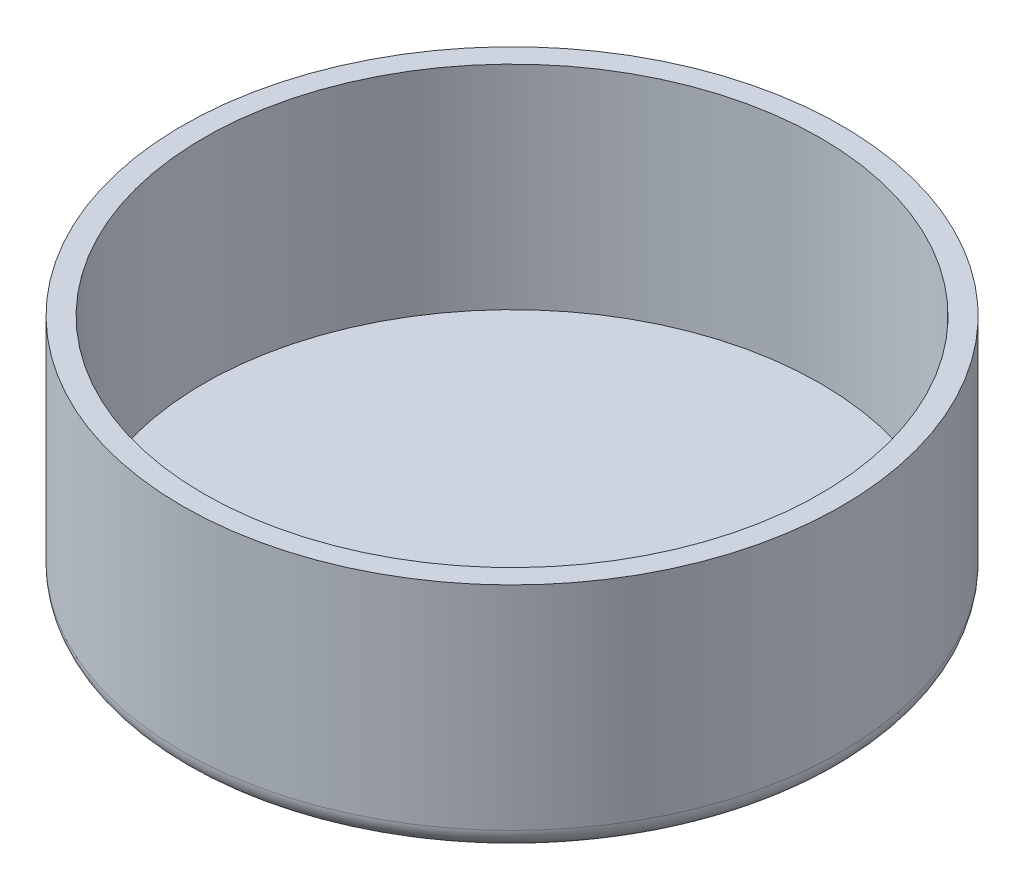
ISO-10303-21;
HEADER;
FILE_DESCRIPTION(('STEP AP214'),'2;1');
FILE_NAME('part.step','',(''),(''),'','','');
FILE_SCHEMA(('AUTOMOTIVE_DESIGN { 1 0 10303 214 1 1 1 1 }'));
ENDSEC;
DATA;
#1=APPLICATION_CONTEXT('core data for automotive mechanical design processes');
#2=APPLICATION_PROTOCOL_DEFINITION('international standard','automotive_design',2000,#1);
#3=PRODUCT_CONTEXT('',#1,'mechanical');
#4=PRODUCT('Part','Part','',(#3));
#5=PRODUCT_RELATED_PRODUCT_CATEGORY('part','',(#4));
#6=PRODUCT_DEFINITION_FORMATION('','',#4);
#7=PRODUCT_DEFINITION_CONTEXT('part definition',#1,'design');
#8=PRODUCT_DEFINITION('design','',#6,#7);
#9=PRODUCT_DEFINITION_SHAPE('','',#8);
#10=(LENGTH_UNIT() NAMED_UNIT(*) SI_UNIT(.MILLI.,.METRE.));
#11=(NAMED_UNIT(*) PLANE_ANGLE_UNIT() SI_UNIT($,.RADIAN.));
#12=(NAMED_UNIT(*) SI_UNIT($,.STERADIAN.) SOLID_ANGLE_UNIT());
#13=UNCERTAINTY_MEASURE_WITH_UNIT(LENGTH_MEASURE(1.E-05),#10,'distance_accuracy_value','');
#14=(GEOMETRIC_REPRESENTATION_CONTEXT(3) GLOBAL_UNCERTAINTY_ASSIGNED_CONTEXT((#13)) GLOBAL_UNIT_ASSIGNED_CONTEXT((#10,
#11,#12)) REPRESENTATION_CONTEXT('',''));
#15=CARTESIAN_POINT('',(0.,0.,0.));
#16=DIRECTION('',(0.,0.,1.));
#17=DIRECTION('',(1.,0.,0.));
#18=AXIS2_PLACEMENT_3D('',#15,#16,#17);
#19=CARTESIAN_POINT('',(0.,1.,0.));
#20=DIRECTION('',(0.,-1.,0.));
#21=DIRECTION('',(0.,0.,-1.));
#22=AXIS2_PLACEMENT_3D('',#19,#20,#21);
#23=CYLINDRICAL_SURFACE('',#22,15.5);
#24=CARTESIAN_POINT('',(0.,1.,0.));
#25=DIRECTION('',(0.,1.,0.));
#26=DIRECTION('',(0.,0.,1.));
#27=AXIS2_PLACEMENT_3D('',#24,#25,#26);
#28=CIRCLE('',#27,15.5);
#29=CARTESIAN_POINT('',(0.,1.,15.5));
#30=VERTEX_POINT('',#29);
#31=EDGE_CURVE('E38',#30,#30,#28,.T.);
#32=ORIENTED_EDGE('',*,*,#31,.T.);
#33=EDGE_LOOP('',(#32));
#34=FACE_BOUND('',#33,.T.);
#35=CARTESIAN_POINT('',(0.,11.,0.));
#36=DIRECTION('',(0.,1.,0.));
#37=DIRECTION('',(0.,0.,1.));
#38=AXIS2_PLACEMENT_3D('',#35,#36,#37);
#39=CIRCLE('',#38,15.5);
#40=CARTESIAN_POINT('',(0.,11.,15.5));
#41=VERTEX_POINT('',#40);
#42=EDGE_CURVE('E46',#41,#41,#39,.T.);
#43=ORIENTED_EDGE('',*,*,#42,.F.);
#44=EDGE_LOOP('',(#43));
#45=FACE_BOUND('',#44,.T.);
#46=ADVANCED_FACE('F31',(#34,#45),#23,.T.);
#47=CARTESIAN_POINT('',(0.,0.,0.));
#48=DIRECTION('',(0.,1.,0.));
#49=DIRECTION('',(0.,0.,1.));
#50=AXIS2_PLACEMENT_3D('',#47,#48,#49);
#51=PLANE('',#50);
#52=CARTESIAN_POINT('',(0.,0.,0.));
#53=DIRECTION('',(0.,1.,0.));
#54=DIRECTION('',(0.,0.,1.));
#55=AXIS2_PLACEMENT_3D('',#52,#53,#54);
#56=CIRCLE('',#55,14.5);
#57=CARTESIAN_POINT('',(0.,0.,14.5));
#58=VERTEX_POINT('',#57);
#59=EDGE_CURVE('E10',#58,#58,#56,.F.);
#60=ORIENTED_EDGE('',*,*,#59,.T.);
#61=EDGE_LOOP('',(#60));
#62=FACE_BOUND('',#61,.T.);
#63=ADVANCED_FACE('F60',(#62),#51,.F.);
#64=CARTESIAN_POINT('',(0.,11.,0.));
#65=DIRECTION('',(0.,1.,0.));
#66=DIRECTION('',(0.,0.,1.));
#67=AXIS2_PLACEMENT_3D('',#64,#65,#66);
#68=PLANE('',#67);
#69=ORIENTED_EDGE('',*,*,#42,.T.);
#70=EDGE_LOOP('',(#69));
#71=FACE_BOUND('',#70,.T.);
#72=CARTESIAN_POINT('',(0.,11.,0.));
#73=DIRECTION('',(0.,1.,0.));
#74=DIRECTION('',(0.,0.,1.));
#75=AXIS2_PLACEMENT_3D('',#72,#73,#74);
#76=CIRCLE('',#75,14.5);
#77=CARTESIAN_POINT('',(0.,11.,14.5));
#78=VERTEX_POINT('',#77);
#79=EDGE_CURVE('E51',#78,#78,#76,.T.);
#80=ORIENTED_EDGE('',*,*,#79,.F.);
#81=EDGE_LOOP('',(#80));
#82=FACE_BOUND('',#81,.T.);
#83=ADVANCED_FACE('F58',(#71,#82),#68,.T.);
#84=CARTESIAN_POINT('',(0.,11.,0.));
#85=DIRECTION('',(0.,-1.,0.));
#86=DIRECTION('',(0.,0.,-1.));
#87=AXIS2_PLACEMENT_3D('',#84,#85,#86);
#88=CYLINDRICAL_SURFACE('',#87,14.5);
#89=ORIENTED_EDGE('',*,*,#79,.T.);
#90=EDGE_LOOP('',(#89));
#91=FACE_BOUND('',#90,.T.);
#92=CARTESIAN_POINT('',(0.,1.,0.));
#93=DIRECTION('',(0.,1.,0.));
#94=DIRECTION('',(0.,0.,1.));
#95=AXIS2_PLACEMENT_3D('',#92,#93,#94);
#96=CIRCLE('',#95,14.5);
#97=CARTESIAN_POINT('',(0.,1.,14.5));
#98=VERTEX_POINT('',#97);
#99=EDGE_CURVE('E42',#98,#98,#96,.F.);
#100=ORIENTED_EDGE('',*,*,#99,.T.);
#101=EDGE_LOOP('',(#100));
#102=FACE_BOUND('',#101,.T.);
#103=ADVANCED_FACE('F55',(#91,#102),#88,.F.);
#104=CARTESIAN_POINT('',(0.,1.,0.));
#105=DIRECTION('',(0.,1.,0.));
#106=DIRECTION('',(0.,0.,1.));
#107=AXIS2_PLACEMENT_3D('',#104,#105,#106);
#108=PLANE('',#107);
#109=ORIENTED_EDGE('',*,*,#99,.F.);
#110=EDGE_LOOP('',(#109));
#111=FACE_BOUND('',#110,.T.);
#112=ADVANCED_FACE('F67',(#111),#108,.T.);
#113=CARTESIAN_POINT('',(0.,1.,0.));
#114=DIRECTION('',(0.,1.,0.));
#115=DIRECTION('',(0.,0.,1.));
#116=AXIS2_PLACEMENT_3D('',#113,#114,#115);
#117=TOROIDAL_SURFACE('',#116,14.5,1.);
#118=ORIENTED_EDGE('',*,*,#59,.F.);
#119=EDGE_LOOP('',(#118));
#120=FACE_BOUND('',#119,.T.);
#121=ORIENTED_EDGE('',*,*,#31,.F.);
#122=EDGE_LOOP('',(#121));
#123=FACE_BOUND('',#122,.T.);
#124=ADVANCED_FACE('F33',(#120,#123),#117,.T.);
#125=CLOSED_SHELL('',(#46,#63,#83,#103,#112,#124));
#126=MANIFOLD_SOLID_BREP('B2',#125);
#127=ADVANCED_BREP_SHAPE_REPRESENTATION('',(#18,#126),#14);
#128=SHAPE_DEFINITION_REPRESENTATION(#9,#127);
ENDSEC;
END-ISO-10303-21;
